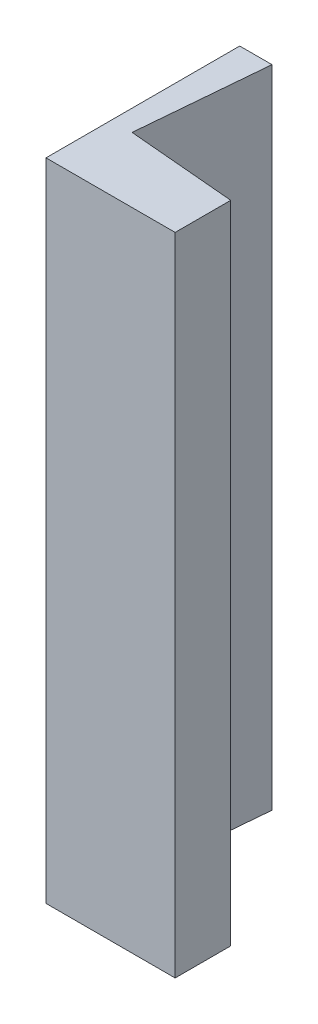
ISO-10303-21;
HEADER;
FILE_DESCRIPTION(('STEP AP214'),'2;1');
FILE_NAME('part.step','',(''),(''),'','','');
FILE_SCHEMA(('AUTOMOTIVE_DESIGN { 1 0 10303 214 1 1 1 1 }'));
ENDSEC;
DATA;
#1=APPLICATION_CONTEXT('core data for automotive mechanical design processes');
#2=APPLICATION_PROTOCOL_DEFINITION('international standard','automotive_design',2000,#1);
#3=PRODUCT_CONTEXT('',#1,'mechanical');
#4=PRODUCT('Part','Part','',(#3));
#5=PRODUCT_RELATED_PRODUCT_CATEGORY('part','',(#4));
#6=PRODUCT_DEFINITION_FORMATION('','',#4);
#7=PRODUCT_DEFINITION_CONTEXT('part definition',#1,'design');
#8=PRODUCT_DEFINITION('design','',#6,#7);
#9=PRODUCT_DEFINITION_SHAPE('','',#8);
#10=(LENGTH_UNIT() NAMED_UNIT(*) SI_UNIT(.MILLI.,.METRE.));
#11=(NAMED_UNIT(*) PLANE_ANGLE_UNIT() SI_UNIT($,.RADIAN.));
#12=(NAMED_UNIT(*) SI_UNIT($,.STERADIAN.) SOLID_ANGLE_UNIT());
#13=UNCERTAINTY_MEASURE_WITH_UNIT(LENGTH_MEASURE(1.E-05),#10,'distance_accuracy_value','');
#14=(GEOMETRIC_REPRESENTATION_CONTEXT(3) GLOBAL_UNCERTAINTY_ASSIGNED_CONTEXT((#13)) GLOBAL_UNIT_ASSIGNED_CONTEXT((#10,
#11,#12)) REPRESENTATION_CONTEXT('',''));
#15=CARTESIAN_POINT('',(0.,0.,0.));
#16=DIRECTION('',(0.,0.,1.));
#17=DIRECTION('',(1.,0.,0.));
#18=AXIS2_PLACEMENT_3D('',#15,#16,#17);
#19=CARTESIAN_POINT('',(-12.7,127.,19.05));
#20=DIRECTION('',(1.,0.,0.));
#21=DIRECTION('',(0.,0.,-1.));
#22=AXIS2_PLACEMENT_3D('',#19,#20,#21);
#23=PLANE('',#22);
#24=DIRECTION('',(0.,0.,1.));
#25=VECTOR('',#24,1.);
#26=CARTESIAN_POINT('',(-12.7,0.,19.05));
#27=LINE('',#26,#25);
#28=CARTESIAN_POINT('',(-12.7,0.,-19.05));
#29=VERTEX_POINT('',#28);
#30=CARTESIAN_POINT('',(-12.7,0.,19.05));
#31=VERTEX_POINT('',#30);
#32=EDGE_CURVE('E117',#29,#31,#27,.T.);
#33=ORIENTED_EDGE('',*,*,#32,.T.);
#34=DIRECTION('',(0.,-1.,0.));
#35=VECTOR('',#34,1.);
#36=CARTESIAN_POINT('',(-12.7,127.,19.05));
#37=LINE('',#36,#35);
#38=CARTESIAN_POINT('',(-12.7,127.,19.05));
#39=VERTEX_POINT('',#38);
#40=EDGE_CURVE('E11',#39,#31,#37,.T.);
#41=ORIENTED_EDGE('',*,*,#40,.F.);
#42=DIRECTION('',(0.,0.,1.));
#43=VECTOR('',#42,1.);
#44=CARTESIAN_POINT('',(-12.7,127.,19.05));
#45=LINE('',#44,#43);
#46=CARTESIAN_POINT('',(-12.7,127.,-19.05));
#47=VERTEX_POINT('',#46);
#48=EDGE_CURVE('E127',#47,#39,#45,.T.);
#49=ORIENTED_EDGE('',*,*,#48,.F.);
#50=DIRECTION('',(0.,-1.,0.));
#51=VECTOR('',#50,1.);
#52=CARTESIAN_POINT('',(-12.7,127.,-19.05));
#53=LINE('',#52,#51);
#54=EDGE_CURVE('E113',#47,#29,#53,.T.);
#55=ORIENTED_EDGE('',*,*,#54,.T.);
#56=EDGE_LOOP('',(#33,#41,#49,#55));
#57=FACE_BOUND('',#56,.T.);
#58=ADVANCED_FACE('F33',(#57),#23,.F.);
#59=CARTESIAN_POINT('',(-12.7,127.,19.05));
#60=DIRECTION('',(0.,0.,-1.));
#61=DIRECTION('',(-1.,0.,0.));
#62=AXIS2_PLACEMENT_3D('',#59,#60,#61);
#63=PLANE('',#62);
#64=DIRECTION('',(1.,0.,0.));
#65=VECTOR('',#64,1.);
#66=CARTESIAN_POINT('',(-12.7,0.,19.05));
#67=LINE('',#66,#65);
#68=CARTESIAN_POINT('',(12.7,0.,19.05));
#69=VERTEX_POINT('',#68);
#70=EDGE_CURVE('E120',#31,#69,#67,.T.);
#71=ORIENTED_EDGE('',*,*,#70,.T.);
#72=DIRECTION('',(0.,-1.,0.));
#73=VECTOR('',#72,1.);
#74=CARTESIAN_POINT('',(12.7,127.,19.05));
#75=LINE('',#74,#73);
#76=CARTESIAN_POINT('',(12.7,127.,19.05));
#77=VERTEX_POINT('',#76);
#78=EDGE_CURVE('E41',#77,#69,#75,.T.);
#79=ORIENTED_EDGE('',*,*,#78,.F.);
#80=DIRECTION('',(1.,0.,0.));
#81=VECTOR('',#80,1.);
#82=CARTESIAN_POINT('',(-12.7,127.,19.05));
#83=LINE('',#82,#81);
#84=EDGE_CURVE('E86',#39,#77,#83,.T.);
#85=ORIENTED_EDGE('',*,*,#84,.F.);
#86=ORIENTED_EDGE('',*,*,#40,.T.);
#87=EDGE_LOOP('',(#71,#79,#85,#86));
#88=FACE_BOUND('',#87,.T.);
#89=ADVANCED_FACE('F151',(#88),#63,.F.);
#90=CARTESIAN_POINT('',(12.7,127.,19.05));
#91=DIRECTION('',(-1.,0.,0.));
#92=DIRECTION('',(0.,0.,1.));
#93=AXIS2_PLACEMENT_3D('',#90,#91,#92);
#94=PLANE('',#93);
#95=DIRECTION('',(0.,0.,-1.));
#96=VECTOR('',#95,1.);
#97=CARTESIAN_POINT('',(12.7,0.,19.05));
#98=LINE('',#97,#96);
#99=CARTESIAN_POINT('',(12.7,0.,8.11368291376988));
#100=VERTEX_POINT('',#99);
#101=EDGE_CURVE('E122',#69,#100,#98,.T.);
#102=ORIENTED_EDGE('',*,*,#101,.T.);
#103=DIRECTION('',(0.,-1.,0.));
#104=VECTOR('',#103,1.);
#105=CARTESIAN_POINT('',(12.7,127.,8.11368291376988));
#106=LINE('',#105,#104);
#107=CARTESIAN_POINT('',(12.7,127.,8.11368291376988));
#108=VERTEX_POINT('',#107);
#109=EDGE_CURVE('E108',#108,#100,#106,.T.);
#110=ORIENTED_EDGE('',*,*,#109,.F.);
#111=DIRECTION('',(0.,0.,-1.));
#112=VECTOR('',#111,1.);
#113=CARTESIAN_POINT('',(12.7,127.,19.05));
#114=LINE('',#113,#112);
#115=EDGE_CURVE('E99',#77,#108,#114,.T.);
#116=ORIENTED_EDGE('',*,*,#115,.F.);
#117=ORIENTED_EDGE('',*,*,#78,.T.);
#118=EDGE_LOOP('',(#102,#110,#116,#117));
#119=FACE_BOUND('',#118,.T.);
#120=ADVANCED_FACE('F133',(#119),#94,.F.);
#121=CARTESIAN_POINT('',(-8.56375586579065,127.,6.25334533153032));
#122=DIRECTION('',(-0.0871557427476583,0.,0.996194698091746));
#123=DIRECTION('',(0.996194698091746,0.,0.0871557427476583));
#124=AXIS2_PLACEMENT_3D('',#121,#122,#123);
#125=PLANE('',#124);
#126=DIRECTION('',(-0.996194698091745,0.,-0.0871557427476583));
#127=VECTOR('',#126,1.);
#128=CARTESIAN_POINT('',(-8.56375586579065,0.,6.25334533153032));
#129=LINE('',#128,#127);
#130=CARTESIAN_POINT('',(-8.56375586579065,0.,6.25334533153032));
#131=VERTEX_POINT('',#130);
#132=EDGE_CURVE('E107',#100,#131,#129,.T.);
#133=ORIENTED_EDGE('',*,*,#132,.T.);
#134=DIRECTION('',(0.,-1.,0.));
#135=VECTOR('',#134,1.);
#136=CARTESIAN_POINT('',(-8.56375586579065,127.,6.25334533153032));
#137=LINE('',#136,#135);
#138=CARTESIAN_POINT('',(-8.56375586579065,127.,6.25334533153032));
#139=VERTEX_POINT('',#138);
#140=EDGE_CURVE('E104',#139,#131,#137,.T.);
#141=ORIENTED_EDGE('',*,*,#140,.F.);
#142=DIRECTION('',(-0.996194698091745,0.,-0.0871557427476583));
#143=VECTOR('',#142,1.);
#144=CARTESIAN_POINT('',(-8.56375586579065,127.,6.25334533153032));
#145=LINE('',#144,#143);
#146=EDGE_CURVE('E93',#108,#139,#145,.T.);
#147=ORIENTED_EDGE('',*,*,#146,.F.);
#148=ORIENTED_EDGE('',*,*,#109,.T.);
#149=EDGE_LOOP('',(#133,#141,#147,#148));
#150=FACE_BOUND('',#149,.T.);
#151=ADVANCED_FACE('F105',(#150),#125,.F.);
#152=CARTESIAN_POINT('',(-6.35000000000004,127.,-19.05));
#153=DIRECTION('',(-0.996194698091745,0.,-0.087155742747662));
#154=DIRECTION('',(-0.087155742747662,0.,0.996194698091745));
#155=AXIS2_PLACEMENT_3D('',#152,#153,#154);
#156=PLANE('',#155);
#157=DIRECTION('',(0.087155742747662,0.,-0.996194698091745));
#158=VECTOR('',#157,1.);
#159=CARTESIAN_POINT('',(-6.35000000000004,0.,-19.05));
#160=LINE('',#159,#158);
#161=CARTESIAN_POINT('',(-6.35000000000004,0.,-19.05));
#162=VERTEX_POINT('',#161);
#163=EDGE_CURVE('E72',#131,#162,#160,.T.);
#164=ORIENTED_EDGE('',*,*,#163,.T.);
#165=DIRECTION('',(0.,-1.,0.));
#166=VECTOR('',#165,1.);
#167=CARTESIAN_POINT('',(-6.35000000000004,127.,-19.05));
#168=LINE('',#167,#166);
#169=CARTESIAN_POINT('',(-6.35000000000004,127.,-19.05));
#170=VERTEX_POINT('',#169);
#171=EDGE_CURVE('E109',#170,#162,#168,.T.);
#172=ORIENTED_EDGE('',*,*,#171,.F.);
#173=DIRECTION('',(0.087155742747662,0.,-0.996194698091745));
#174=VECTOR('',#173,1.);
#175=CARTESIAN_POINT('',(-6.35000000000004,127.,-19.05));
#176=LINE('',#175,#174);
#177=EDGE_CURVE('E97',#139,#170,#176,.T.);
#178=ORIENTED_EDGE('',*,*,#177,.F.);
#179=ORIENTED_EDGE('',*,*,#140,.T.);
#180=EDGE_LOOP('',(#164,#172,#178,#179));
#181=FACE_BOUND('',#180,.T.);
#182=ADVANCED_FACE('F111',(#181),#156,.F.);
#183=CARTESIAN_POINT('',(-12.7,127.,-19.05));
#184=DIRECTION('',(0.,0.,1.));
#185=DIRECTION('',(1.,0.,0.));
#186=AXIS2_PLACEMENT_3D('',#183,#184,#185);
#187=PLANE('',#186);
#188=DIRECTION('',(-1.,0.,0.));
#189=VECTOR('',#188,1.);
#190=CARTESIAN_POINT('',(-12.7,0.,-19.05));
#191=LINE('',#190,#189);
#192=EDGE_CURVE('E78',#162,#29,#191,.T.);
#193=ORIENTED_EDGE('',*,*,#192,.T.);
#194=ORIENTED_EDGE('',*,*,#54,.F.);
#195=DIRECTION('',(-1.,0.,0.));
#196=VECTOR('',#195,1.);
#197=CARTESIAN_POINT('',(-12.7,127.,-19.05));
#198=LINE('',#197,#196);
#199=EDGE_CURVE('E49',#170,#47,#198,.T.);
#200=ORIENTED_EDGE('',*,*,#199,.F.);
#201=ORIENTED_EDGE('',*,*,#171,.T.);
#202=EDGE_LOOP('',(#193,#194,#200,#201));
#203=FACE_BOUND('',#202,.T.);
#204=ADVANCED_FACE('F140',(#203),#187,.F.);
#205=CARTESIAN_POINT('',(0.,127.,0.));
#206=DIRECTION('',(0.,-1.,0.));
#207=DIRECTION('',(0.,0.,-1.));
#208=AXIS2_PLACEMENT_3D('',#205,#206,#207);
#209=PLANE('',#208);
#210=ORIENTED_EDGE('',*,*,#48,.T.);
#211=ORIENTED_EDGE('',*,*,#84,.T.);
#212=ORIENTED_EDGE('',*,*,#115,.T.);
#213=ORIENTED_EDGE('',*,*,#146,.T.);
#214=ORIENTED_EDGE('',*,*,#177,.T.);
#215=ORIENTED_EDGE('',*,*,#199,.T.);
#216=EDGE_LOOP('',(#210,#211,#212,#213,#214,#215));
#217=FACE_BOUND('',#216,.T.);
#218=ADVANCED_FACE('F95',(#217),#209,.F.);
#219=CARTESIAN_POINT('',(0.,0.,0.));
#220=DIRECTION('',(0.,-1.,0.));
#221=DIRECTION('',(0.,0.,-1.));
#222=AXIS2_PLACEMENT_3D('',#219,#220,#221);
#223=PLANE('',#222);
#224=ORIENTED_EDGE('',*,*,#32,.F.);
#225=ORIENTED_EDGE('',*,*,#192,.F.);
#226=ORIENTED_EDGE('',*,*,#163,.F.);
#227=ORIENTED_EDGE('',*,*,#132,.F.);
#228=ORIENTED_EDGE('',*,*,#101,.F.);
#229=ORIENTED_EDGE('',*,*,#70,.F.);
#230=EDGE_LOOP('',(#224,#225,#226,#227,#228,#229));
#231=FACE_BOUND('',#230,.T.);
#232=ADVANCED_FACE('F136',(#231),#223,.T.);
#233=CLOSED_SHELL('',(#58,#89,#120,#151,#182,#204,#218,#232));
#234=MANIFOLD_SOLID_BREP('B2',#233);
#235=ADVANCED_BREP_SHAPE_REPRESENTATION('',(#18,#234),#14);
#236=SHAPE_DEFINITION_REPRESENTATION(#9,#235);
ENDSEC;
END-ISO-10303-21;
